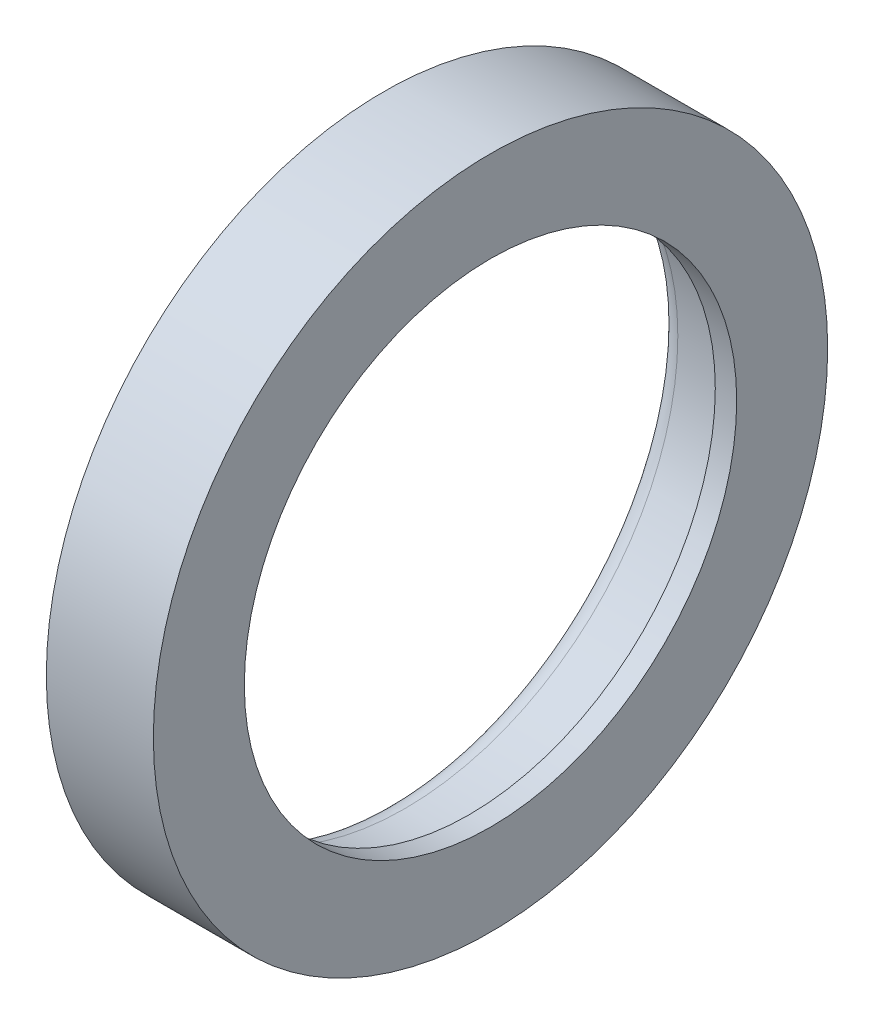
ISO-10303-21;
HEADER;
FILE_DESCRIPTION(('STEP AP214'),'2;1');
FILE_NAME('part.step','',(''),(''),'','','');
FILE_SCHEMA(('AUTOMOTIVE_DESIGN { 1 0 10303 214 1 1 1 1 }'));
ENDSEC;
DATA;
#1=APPLICATION_CONTEXT('core data for automotive mechanical design processes');
#2=APPLICATION_PROTOCOL_DEFINITION('international standard','automotive_design',2000,#1);
#3=PRODUCT_CONTEXT('',#1,'mechanical');
#4=PRODUCT('Part','Part','',(#3));
#5=PRODUCT_RELATED_PRODUCT_CATEGORY('part','',(#4));
#6=PRODUCT_DEFINITION_FORMATION('','',#4);
#7=PRODUCT_DEFINITION_CONTEXT('part definition',#1,'design');
#8=PRODUCT_DEFINITION('design','',#6,#7);
#9=PRODUCT_DEFINITION_SHAPE('','',#8);
#10=(LENGTH_UNIT() NAMED_UNIT(*) SI_UNIT(.MILLI.,.METRE.));
#11=(NAMED_UNIT(*) PLANE_ANGLE_UNIT() SI_UNIT($,.RADIAN.));
#12=(NAMED_UNIT(*) SI_UNIT($,.STERADIAN.) SOLID_ANGLE_UNIT());
#13=UNCERTAINTY_MEASURE_WITH_UNIT(LENGTH_MEASURE(1.E-05),#10,'distance_accuracy_value','');
#14=(GEOMETRIC_REPRESENTATION_CONTEXT(3) GLOBAL_UNCERTAINTY_ASSIGNED_CONTEXT((#13)) GLOBAL_UNIT_ASSIGNED_CONTEXT((#10,
#11,#12)) REPRESENTATION_CONTEXT('',''));
#15=CARTESIAN_POINT('',(0.,0.,0.));
#16=DIRECTION('',(0.,0.,1.));
#17=DIRECTION('',(1.,0.,0.));
#18=AXIS2_PLACEMENT_3D('',#15,#16,#17);
#19=CARTESIAN_POINT('',(-5.,0.,0.));
#20=DIRECTION('',(1.,0.,0.));
#21=DIRECTION('',(0.,0.,-1.));
#22=AXIS2_PLACEMENT_3D('',#19,#20,#21);
#23=CYLINDRICAL_SURFACE('',#22,12.75);
#24=CARTESIAN_POINT('',(-4.,0.,0.));
#25=DIRECTION('',(1.,0.,0.));
#26=DIRECTION('',(0.,0.,-1.));
#27=AXIS2_PLACEMENT_3D('',#24,#25,#26);
#28=CIRCLE('',#27,12.75);
#29=CARTESIAN_POINT('',(-4.,0.,-12.75));
#30=VERTEX_POINT('',#29);
#31=EDGE_CURVE('E43',#30,#30,#28,.F.);
#32=ORIENTED_EDGE('',*,*,#31,.T.);
#33=EDGE_LOOP('',(#32));
#34=FACE_BOUND('',#33,.T.);
#35=CARTESIAN_POINT('',(-1.,0.,0.));
#36=DIRECTION('',(1.,0.,0.));
#37=DIRECTION('',(0.,0.,-1.));
#38=AXIS2_PLACEMENT_3D('',#35,#36,#37);
#39=CIRCLE('',#38,12.75);
#40=CARTESIAN_POINT('',(-1.,0.,-12.75));
#41=VERTEX_POINT('',#40);
#42=EDGE_CURVE('E10',#41,#41,#39,.F.);
#43=ORIENTED_EDGE('',*,*,#42,.F.);
#44=EDGE_LOOP('',(#43));
#45=FACE_BOUND('',#44,.T.);
#46=ADVANCED_FACE('F36',(#34,#45),#23,.F.);
#47=CARTESIAN_POINT('',(-5.,0.,0.));
#48=DIRECTION('',(1.,0.,0.));
#49=DIRECTION('',(0.,0.,-1.));
#50=AXIS2_PLACEMENT_3D('',#47,#48,#49);
#51=CYLINDRICAL_SURFACE('',#50,15.75);
#52=CARTESIAN_POINT('',(-5.,0.,0.));
#53=DIRECTION('',(1.,0.,0.));
#54=DIRECTION('',(0.,0.,-1.));
#55=AXIS2_PLACEMENT_3D('',#52,#53,#54);
#56=CIRCLE('',#55,15.75);
#57=CARTESIAN_POINT('',(-5.,0.,-15.75));
#58=VERTEX_POINT('',#57);
#59=EDGE_CURVE('E51',#58,#58,#56,.T.);
#60=ORIENTED_EDGE('',*,*,#59,.T.);
#61=EDGE_LOOP('',(#60));
#62=FACE_BOUND('',#61,.T.);
#63=CARTESIAN_POINT('',(0.,0.,0.));
#64=DIRECTION('',(1.,0.,0.));
#65=DIRECTION('',(0.,0.,-1.));
#66=AXIS2_PLACEMENT_3D('',#63,#64,#65);
#67=CIRCLE('',#66,15.75);
#68=CARTESIAN_POINT('',(0.,0.,-15.75));
#69=VERTEX_POINT('',#68);
#70=EDGE_CURVE('E54',#69,#69,#67,.T.);
#71=ORIENTED_EDGE('',*,*,#70,.F.);
#72=EDGE_LOOP('',(#71));
#73=FACE_BOUND('',#72,.T.);
#74=ADVANCED_FACE('F84',(#62,#73),#51,.T.);
#75=CARTESIAN_POINT('',(-5.,0.,0.));
#76=DIRECTION('',(1.,0.,0.));
#77=DIRECTION('',(0.,0.,-1.));
#78=AXIS2_PLACEMENT_3D('',#75,#76,#77);
#79=PLANE('',#78);
#80=CARTESIAN_POINT('',(-5.,0.,0.));
#81=DIRECTION('',(1.,0.,0.));
#82=DIRECTION('',(0.,0.,-1.));
#83=AXIS2_PLACEMENT_3D('',#80,#81,#82);
#84=CIRCLE('',#83,13.75);
#85=CARTESIAN_POINT('',(-5.,0.,-13.75));
#86=VERTEX_POINT('',#85);
#87=EDGE_CURVE('E47',#86,#86,#84,.T.);
#88=ORIENTED_EDGE('',*,*,#87,.T.);
#89=EDGE_LOOP('',(#88));
#90=FACE_BOUND('',#89,.T.);
#91=ORIENTED_EDGE('',*,*,#59,.F.);
#92=EDGE_LOOP('',(#91));
#93=FACE_BOUND('',#92,.T.);
#94=ADVANCED_FACE('F76',(#90,#93),#79,.F.);
#95=CARTESIAN_POINT('',(0.,0.,0.));
#96=DIRECTION('',(1.,0.,0.));
#97=DIRECTION('',(0.,0.,-1.));
#98=AXIS2_PLACEMENT_3D('',#95,#96,#97);
#99=PLANE('',#98);
#100=ORIENTED_EDGE('',*,*,#70,.T.);
#101=EDGE_LOOP('',(#100));
#102=FACE_BOUND('',#101,.T.);
#103=CARTESIAN_POINT('',(0.,0.,0.));
#104=DIRECTION('',(1.,0.,0.));
#105=DIRECTION('',(0.,0.,-1.));
#106=AXIS2_PLACEMENT_3D('',#103,#104,#105);
#107=CIRCLE('',#106,11.5);
#108=CARTESIAN_POINT('',(0.,0.,-11.5));
#109=VERTEX_POINT('',#108);
#110=EDGE_CURVE('E60',#109,#109,#107,.T.);
#111=ORIENTED_EDGE('',*,*,#110,.F.);
#112=EDGE_LOOP('',(#111));
#113=FACE_BOUND('',#112,.T.);
#114=ADVANCED_FACE('F74',(#102,#113),#99,.T.);
#115=CARTESIAN_POINT('',(-4.,0.,0.));
#116=DIRECTION('',(1.,0.,0.));
#117=DIRECTION('',(0.,0.,-1.));
#118=AXIS2_PLACEMENT_3D('',#115,#116,#117);
#119=TOROIDAL_SURFACE('',#118,13.75,1.);
#120=ORIENTED_EDGE('',*,*,#31,.F.);
#121=EDGE_LOOP('',(#120));
#122=FACE_BOUND('',#121,.T.);
#123=ORIENTED_EDGE('',*,*,#87,.F.);
#124=EDGE_LOOP('',(#123));
#125=FACE_BOUND('',#124,.T.);
#126=ADVANCED_FACE('F38',(#122,#125),#119,.T.);
#127=CARTESIAN_POINT('',(-1.,0.,0.));
#128=DIRECTION('',(1.,0.,0.));
#129=DIRECTION('',(0.,0.,-1.));
#130=AXIS2_PLACEMENT_3D('',#127,#128,#129);
#131=CYLINDRICAL_SURFACE('',#130,11.5);
#132=CARTESIAN_POINT('',(-1.,0.,0.));
#133=DIRECTION('',(1.,0.,0.));
#134=DIRECTION('',(0.,0.,-1.));
#135=AXIS2_PLACEMENT_3D('',#132,#133,#134);
#136=CIRCLE('',#135,11.5);
#137=CARTESIAN_POINT('',(-1.,0.,-11.5));
#138=VERTEX_POINT('',#137);
#139=EDGE_CURVE('E57',#138,#138,#136,.T.);
#140=ORIENTED_EDGE('',*,*,#139,.F.);
#141=EDGE_LOOP('',(#140));
#142=FACE_BOUND('',#141,.T.);
#143=ORIENTED_EDGE('',*,*,#110,.T.);
#144=EDGE_LOOP('',(#143));
#145=FACE_BOUND('',#144,.T.);
#146=ADVANCED_FACE('F68',(#142,#145),#131,.F.);
#147=CARTESIAN_POINT('',(-1.,0.,0.));
#148=DIRECTION('',(1.,0.,0.));
#149=DIRECTION('',(0.,0.,-1.));
#150=AXIS2_PLACEMENT_3D('',#147,#148,#149);
#151=PLANE('',#150);
#152=ORIENTED_EDGE('',*,*,#139,.T.);
#153=EDGE_LOOP('',(#152));
#154=FACE_BOUND('',#153,.T.);
#155=ORIENTED_EDGE('',*,*,#42,.T.);
#156=EDGE_LOOP('',(#155));
#157=FACE_BOUND('',#156,.T.);
#158=ADVANCED_FACE('F66',(#154,#157),#151,.F.);
#159=CLOSED_SHELL('',(#46,#74,#94,#114,#126,#146,#158));
#160=MANIFOLD_SOLID_BREP('B2',#159);
#161=ADVANCED_BREP_SHAPE_REPRESENTATION('',(#18,#160),#14);
#162=SHAPE_DEFINITION_REPRESENTATION(#9,#161);
ENDSEC;
END-ISO-10303-21;
